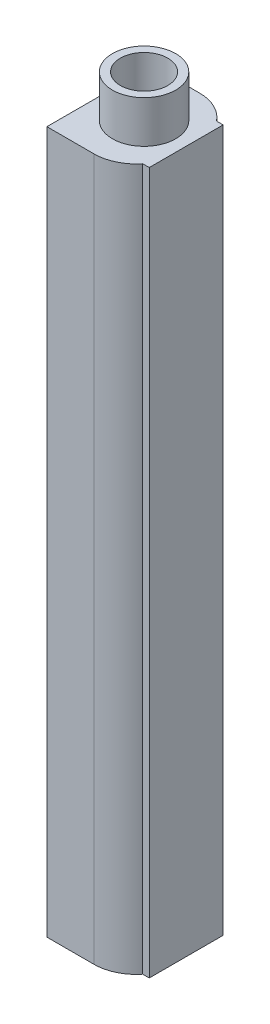
ISO-10303-21;
HEADER;
FILE_DESCRIPTION(('STEP AP214'),'2;1');
FILE_NAME('part.step','',(''),(''),'','','');
FILE_SCHEMA(('AUTOMOTIVE_DESIGN { 1 0 10303 214 1 1 1 1 }'));
ENDSEC;
DATA;
#1=APPLICATION_CONTEXT('core data for automotive mechanical design processes');
#2=APPLICATION_PROTOCOL_DEFINITION('international standard','automotive_design',2000,#1);
#3=PRODUCT_CONTEXT('',#1,'mechanical');
#4=PRODUCT('Part','Part','',(#3));
#5=PRODUCT_RELATED_PRODUCT_CATEGORY('part','',(#4));
#6=PRODUCT_DEFINITION_FORMATION('','',#4);
#7=PRODUCT_DEFINITION_CONTEXT('part definition',#1,'design');
#8=PRODUCT_DEFINITION('design','',#6,#7);
#9=PRODUCT_DEFINITION_SHAPE('','',#8);
#10=(LENGTH_UNIT() NAMED_UNIT(*) SI_UNIT(.MILLI.,.METRE.));
#11=(NAMED_UNIT(*) PLANE_ANGLE_UNIT() SI_UNIT($,.RADIAN.));
#12=(NAMED_UNIT(*) SI_UNIT($,.STERADIAN.) SOLID_ANGLE_UNIT());
#13=UNCERTAINTY_MEASURE_WITH_UNIT(LENGTH_MEASURE(1.E-05),#10,'distance_accuracy_value','');
#14=(GEOMETRIC_REPRESENTATION_CONTEXT(3) GLOBAL_UNCERTAINTY_ASSIGNED_CONTEXT((#13)) GLOBAL_UNIT_ASSIGNED_CONTEXT((#10,
#11,#12)) REPRESENTATION_CONTEXT('',''));
#15=CARTESIAN_POINT('',(0.,0.,0.));
#16=DIRECTION('',(0.,0.,1.));
#17=DIRECTION('',(1.,0.,0.));
#18=AXIS2_PLACEMENT_3D('',#15,#16,#17);
#19=CARTESIAN_POINT('',(-7.4849979983984,0.,5.));
#20=DIRECTION('',(0.,1.,0.));
#21=DIRECTION('',(0.,0.,1.));
#22=AXIS2_PLACEMENT_3D('',#19,#20,#21);
#23=PLANE('',#22);
#24=CARTESIAN_POINT('',(-7.4849979983984,0.,5.));
#25=DIRECTION('',(0.,1.,0.));
#26=DIRECTION('',(0.,0.,1.));
#27=AXIS2_PLACEMENT_3D('',#24,#25,#26);
#28=CIRCLE('',#27,6.5);
#29=CARTESIAN_POINT('',(-2.00777242334674,0.,1.5));
#30=VERTEX_POINT('',#29);
#31=CARTESIAN_POINT('',(-7.48499799839839,0.,-1.5));
#32=VERTEX_POINT('',#31);
#33=EDGE_CURVE('E366',#30,#32,#28,.T.);
#34=ORIENTED_EDGE('',*,*,#33,.T.);
#35=DIRECTION('',(-1.,0.,0.));
#36=VECTOR('',#35,1.);
#37=CARTESIAN_POINT('',(-7.48499799839839,0.,-1.5));
#38=LINE('',#37,#36);
#39=CARTESIAN_POINT('',(-14.9149979983984,0.,-1.5));
#40=VERTEX_POINT('',#39);
#41=EDGE_CURVE('E368',#32,#40,#38,.T.);
#42=ORIENTED_EDGE('',*,*,#41,.T.);
#43=DIRECTION('',(0.,0.,1.));
#44=VECTOR('',#43,1.);
#45=CARTESIAN_POINT('',(-14.9149979983984,0.,-1.5));
#46=LINE('',#45,#44);
#47=CARTESIAN_POINT('',(-14.9149979983984,0.,15.5));
#48=VERTEX_POINT('',#47);
#49=EDGE_CURVE('E371',#40,#48,#46,.T.);
#50=ORIENTED_EDGE('',*,*,#49,.T.);
#51=DIRECTION('',(1.,0.,0.));
#52=VECTOR('',#51,1.);
#53=CARTESIAN_POINT('',(-14.9149979983984,0.,15.5));
#54=LINE('',#53,#52);
#55=CARTESIAN_POINT('',(-7.4849979983984,0.,15.5));
#56=VERTEX_POINT('',#55);
#57=EDGE_CURVE('E374',#48,#56,#54,.T.);
#58=ORIENTED_EDGE('',*,*,#57,.T.);
#59=CARTESIAN_POINT('',(-7.4849979983984,0.,9.));
#60=DIRECTION('',(0.,1.,0.));
#61=DIRECTION('',(0.,0.,1.));
#62=AXIS2_PLACEMENT_3D('',#59,#60,#61);
#63=CIRCLE('',#62,6.5);
#64=CARTESIAN_POINT('',(-2.00777242334674,0.,12.5));
#65=VERTEX_POINT('',#64);
#66=EDGE_CURVE('E377',#56,#65,#63,.T.);
#67=ORIENTED_EDGE('',*,*,#66,.T.);
#68=DIRECTION('',(1.,0.,0.));
#69=VECTOR('',#68,1.);
#70=CARTESIAN_POINT('',(-2.00777242334674,0.,12.5));
#71=LINE('',#70,#69);
#72=CARTESIAN_POINT('',(-1.5,0.,12.5));
#73=VERTEX_POINT('',#72);
#74=EDGE_CURVE('E380',#65,#73,#71,.T.);
#75=ORIENTED_EDGE('',*,*,#74,.T.);
#76=DIRECTION('',(0.,0.,-1.));
#77=VECTOR('',#76,1.);
#78=CARTESIAN_POINT('',(-1.5,0.,12.5));
#79=LINE('',#78,#77);
#80=CARTESIAN_POINT('',(-1.5,0.,1.5));
#81=VERTEX_POINT('',#80);
#82=EDGE_CURVE('E383',#73,#81,#79,.T.);
#83=ORIENTED_EDGE('',*,*,#82,.T.);
#84=DIRECTION('',(-1.,0.,0.));
#85=VECTOR('',#84,1.);
#86=CARTESIAN_POINT('',(-1.5,0.,1.5));
#87=LINE('',#86,#85);
#88=EDGE_CURVE('E167',#81,#30,#87,.T.);
#89=ORIENTED_EDGE('',*,*,#88,.T.);
#90=EDGE_LOOP('',(#34,#42,#50,#58,#67,#75,#83,#89));
#91=FACE_BOUND('',#90,.T.);
#92=ADVANCED_FACE('F33',(#91),#23,.T.);
#93=CARTESIAN_POINT('',(-1.5,131.6,1.5));
#94=DIRECTION('',(0.,0.,1.));
#95=DIRECTION('',(1.,0.,0.));
#96=AXIS2_PLACEMENT_3D('',#93,#94,#95);
#97=PLANE('',#96);
#98=DIRECTION('',(0.,-1.,0.));
#99=VECTOR('',#98,1.);
#100=CARTESIAN_POINT('',(-1.5,131.6,1.5));
#101=LINE('',#100,#99);
#102=CARTESIAN_POINT('',(-1.5,130.1,1.5));
#103=VERTEX_POINT('',#102);
#104=EDGE_CURVE('E158',#103,#81,#101,.T.);
#105=ORIENTED_EDGE('',*,*,#104,.F.);
#106=DIRECTION('',(-1.,0.,0.));
#107=VECTOR('',#106,1.);
#108=CARTESIAN_POINT('',(-1.5,130.1,1.5));
#109=LINE('',#108,#107);
#110=CARTESIAN_POINT('',(-2.00777242334674,130.1,1.5));
#111=VERTEX_POINT('',#110);
#112=EDGE_CURVE('E42',#103,#111,#109,.T.);
#113=ORIENTED_EDGE('',*,*,#112,.T.);
#114=DIRECTION('',(0.,-1.,0.));
#115=VECTOR('',#114,1.);
#116=CARTESIAN_POINT('',(-2.00777242334674,131.6,1.5));
#117=LINE('',#116,#115);
#118=EDGE_CURVE('E168',#111,#30,#117,.T.);
#119=ORIENTED_EDGE('',*,*,#118,.T.);
#120=ORIENTED_EDGE('',*,*,#88,.F.);
#121=EDGE_LOOP('',(#105,#113,#119,#120));
#122=FACE_BOUND('',#121,.T.);
#123=ADVANCED_FACE('F165',(#122),#97,.T.);
#124=CARTESIAN_POINT('',(-1.5,131.6,12.5));
#125=DIRECTION('',(-1.,0.,0.));
#126=DIRECTION('',(0.,0.,1.));
#127=AXIS2_PLACEMENT_3D('',#124,#125,#126);
#128=PLANE('',#127);
#129=DIRECTION('',(0.,-1.,0.));
#130=VECTOR('',#129,1.);
#131=CARTESIAN_POINT('',(-1.5,131.6,12.5));
#132=LINE('',#131,#130);
#133=CARTESIAN_POINT('',(-1.5,130.1,12.5));
#134=VERTEX_POINT('',#133);
#135=EDGE_CURVE('E160',#134,#73,#132,.T.);
#136=ORIENTED_EDGE('',*,*,#135,.F.);
#137=DIRECTION('',(0.,0.,-1.));
#138=VECTOR('',#137,1.);
#139=CARTESIAN_POINT('',(-1.5,130.1,12.5));
#140=LINE('',#139,#138);
#141=EDGE_CURVE('E148',#134,#103,#140,.T.);
#142=ORIENTED_EDGE('',*,*,#141,.T.);
#143=ORIENTED_EDGE('',*,*,#104,.T.);
#144=ORIENTED_EDGE('',*,*,#82,.F.);
#145=EDGE_LOOP('',(#136,#142,#143,#144));
#146=FACE_BOUND('',#145,.T.);
#147=ADVANCED_FACE('F156',(#146),#128,.T.);
#148=CARTESIAN_POINT('',(-2.00777242334674,131.6,12.5));
#149=DIRECTION('',(0.,0.,-1.));
#150=DIRECTION('',(-1.,0.,0.));
#151=AXIS2_PLACEMENT_3D('',#148,#149,#150);
#152=PLANE('',#151);
#153=DIRECTION('',(0.,-1.,0.));
#154=VECTOR('',#153,1.);
#155=CARTESIAN_POINT('',(-2.00777242334674,131.6,12.5));
#156=LINE('',#155,#154);
#157=CARTESIAN_POINT('',(-2.00777242334674,130.1,12.5));
#158=VERTEX_POINT('',#157);
#159=EDGE_CURVE('E170',#158,#65,#156,.T.);
#160=ORIENTED_EDGE('',*,*,#159,.F.);
#161=DIRECTION('',(1.,0.,0.));
#162=VECTOR('',#161,1.);
#163=CARTESIAN_POINT('',(-2.00777242334674,130.1,12.5));
#164=LINE('',#163,#162);
#165=EDGE_CURVE('E161',#158,#134,#164,.T.);
#166=ORIENTED_EDGE('',*,*,#165,.T.);
#167=ORIENTED_EDGE('',*,*,#135,.T.);
#168=ORIENTED_EDGE('',*,*,#74,.F.);
#169=EDGE_LOOP('',(#160,#166,#167,#168));
#170=FACE_BOUND('',#169,.T.);
#171=ADVANCED_FACE('F320',(#170),#152,.T.);
#172=CARTESIAN_POINT('',(-7.4849979983984,131.6,9.));
#173=DIRECTION('',(0.,-1.,0.));
#174=DIRECTION('',(0.,0.,-1.));
#175=AXIS2_PLACEMENT_3D('',#172,#173,#174);
#176=CYLINDRICAL_SURFACE('',#175,6.5);
#177=DIRECTION('',(0.,-1.,0.));
#178=VECTOR('',#177,1.);
#179=CARTESIAN_POINT('',(-7.48499799839839,131.6,15.5));
#180=LINE('',#179,#178);
#181=CARTESIAN_POINT('',(-7.4849979983984,130.1,15.5));
#182=VERTEX_POINT('',#181);
#183=EDGE_CURVE('E176',#182,#56,#180,.T.);
#184=ORIENTED_EDGE('',*,*,#183,.F.);
#185=CARTESIAN_POINT('',(-7.4849979983984,130.1,9.));
#186=DIRECTION('',(0.,1.,0.));
#187=DIRECTION('',(0.,0.,1.));
#188=AXIS2_PLACEMENT_3D('',#185,#186,#187);
#189=CIRCLE('',#188,6.5);
#190=EDGE_CURVE('E353',#182,#158,#189,.T.);
#191=ORIENTED_EDGE('',*,*,#190,.T.);
#192=ORIENTED_EDGE('',*,*,#159,.T.);
#193=ORIENTED_EDGE('',*,*,#66,.F.);
#194=EDGE_LOOP('',(#184,#191,#192,#193));
#195=FACE_BOUND('',#194,.T.);
#196=ADVANCED_FACE('F316',(#195),#176,.F.);
#197=CARTESIAN_POINT('',(-14.9149979983984,131.6,15.5));
#198=DIRECTION('',(0.,0.,-1.));
#199=DIRECTION('',(-1.,0.,0.));
#200=AXIS2_PLACEMENT_3D('',#197,#198,#199);
#201=PLANE('',#200);
#202=DIRECTION('',(0.,-1.,0.));
#203=VECTOR('',#202,1.);
#204=CARTESIAN_POINT('',(-14.9149979983984,131.6,15.5));
#205=LINE('',#204,#203);
#206=CARTESIAN_POINT('',(-14.9149979983984,130.1,15.5));
#207=VERTEX_POINT('',#206);
#208=EDGE_CURVE('E178',#207,#48,#205,.T.);
#209=ORIENTED_EDGE('',*,*,#208,.F.);
#210=DIRECTION('',(1.,0.,0.));
#211=VECTOR('',#210,1.);
#212=CARTESIAN_POINT('',(-14.9149979983984,130.1,15.5));
#213=LINE('',#212,#211);
#214=EDGE_CURVE('E356',#207,#182,#213,.T.);
#215=ORIENTED_EDGE('',*,*,#214,.T.);
#216=ORIENTED_EDGE('',*,*,#183,.T.);
#217=ORIENTED_EDGE('',*,*,#57,.F.);
#218=EDGE_LOOP('',(#209,#215,#216,#217));
#219=FACE_BOUND('',#218,.T.);
#220=ADVANCED_FACE('F312',(#219),#201,.T.);
#221=CARTESIAN_POINT('',(-14.9149979983984,131.6,-1.5));
#222=DIRECTION('',(1.,0.,0.));
#223=DIRECTION('',(0.,0.,-1.));
#224=AXIS2_PLACEMENT_3D('',#221,#222,#223);
#225=PLANE('',#224);
#226=DIRECTION('',(0.,-1.,0.));
#227=VECTOR('',#226,1.);
#228=CARTESIAN_POINT('',(-14.9149979983984,131.6,-1.5));
#229=LINE('',#228,#227);
#230=CARTESIAN_POINT('',(-14.9149979983984,130.1,-1.5));
#231=VERTEX_POINT('',#230);
#232=EDGE_CURVE('E180',#231,#40,#229,.T.);
#233=ORIENTED_EDGE('',*,*,#232,.F.);
#234=DIRECTION('',(0.,0.,1.));
#235=VECTOR('',#234,1.);
#236=CARTESIAN_POINT('',(-14.9149979983984,130.1,-1.5));
#237=LINE('',#236,#235);
#238=EDGE_CURVE('E359',#231,#207,#237,.T.);
#239=ORIENTED_EDGE('',*,*,#238,.T.);
#240=ORIENTED_EDGE('',*,*,#208,.T.);
#241=ORIENTED_EDGE('',*,*,#49,.F.);
#242=EDGE_LOOP('',(#233,#239,#240,#241));
#243=FACE_BOUND('',#242,.T.);
#244=ADVANCED_FACE('F308',(#243),#225,.T.);
#245=CARTESIAN_POINT('',(-7.48499799839839,131.6,-1.5));
#246=DIRECTION('',(0.,0.,1.));
#247=DIRECTION('',(1.,0.,0.));
#248=AXIS2_PLACEMENT_3D('',#245,#246,#247);
#249=PLANE('',#248);
#250=DIRECTION('',(0.,-1.,0.));
#251=VECTOR('',#250,1.);
#252=CARTESIAN_POINT('',(-7.48499799839839,131.6,-1.5));
#253=LINE('',#252,#251);
#254=CARTESIAN_POINT('',(-7.48499799839839,130.1,-1.5));
#255=VERTEX_POINT('',#254);
#256=EDGE_CURVE('E57',#255,#32,#253,.T.);
#257=ORIENTED_EDGE('',*,*,#256,.F.);
#258=DIRECTION('',(-1.,0.,0.));
#259=VECTOR('',#258,1.);
#260=CARTESIAN_POINT('',(-7.48499799839839,130.1,-1.5));
#261=LINE('',#260,#259);
#262=EDGE_CURVE('E362',#255,#231,#261,.T.);
#263=ORIENTED_EDGE('',*,*,#262,.T.);
#264=ORIENTED_EDGE('',*,*,#232,.T.);
#265=ORIENTED_EDGE('',*,*,#41,.F.);
#266=EDGE_LOOP('',(#257,#263,#264,#265));
#267=FACE_BOUND('',#266,.T.);
#268=ADVANCED_FACE('F305',(#267),#249,.T.);
#269=CARTESIAN_POINT('',(-7.4849979983984,131.6,5.));
#270=DIRECTION('',(0.,-1.,0.));
#271=DIRECTION('',(0.,0.,-1.));
#272=AXIS2_PLACEMENT_3D('',#269,#270,#271);
#273=CYLINDRICAL_SURFACE('',#272,6.5);
#274=ORIENTED_EDGE('',*,*,#118,.F.);
#275=CARTESIAN_POINT('',(-7.4849979983984,130.1,5.));
#276=DIRECTION('',(0.,1.,0.));
#277=DIRECTION('',(0.,0.,1.));
#278=AXIS2_PLACEMENT_3D('',#275,#276,#277);
#279=CIRCLE('',#278,6.5);
#280=EDGE_CURVE('E50',#111,#255,#279,.T.);
#281=ORIENTED_EDGE('',*,*,#280,.T.);
#282=ORIENTED_EDGE('',*,*,#256,.T.);
#283=ORIENTED_EDGE('',*,*,#33,.F.);
#284=EDGE_LOOP('',(#274,#281,#282,#283));
#285=FACE_BOUND('',#284,.T.);
#286=ADVANCED_FACE('F302',(#285),#273,.F.);
#287=CARTESIAN_POINT('',(-7.4849979983984,130.1,5.));
#288=DIRECTION('',(0.,1.,0.));
#289=DIRECTION('',(0.,0.,1.));
#290=AXIS2_PLACEMENT_3D('',#287,#288,#289);
#291=PLANE('',#290);
#292=CARTESIAN_POINT('',(-8.2074989991992,130.1,6.78038674362202));
#293=DIRECTION('',(0.,1.,0.));
#294=DIRECTION('',(0.,0.,1.));
#295=AXIS2_PLACEMENT_3D('',#292,#293,#294);
#296=CIRCLE('',#295,4.5);
#297=CARTESIAN_POINT('',(-8.2074989991992,130.1,11.280386743622));
#298=VERTEX_POINT('',#297);
#299=EDGE_CURVE('E37',#298,#298,#296,.T.);
#300=ORIENTED_EDGE('',*,*,#299,.T.);
#301=EDGE_LOOP('',(#300));
#302=FACE_BOUND('',#301,.T.);
#303=ORIENTED_EDGE('',*,*,#280,.F.);
#304=ORIENTED_EDGE('',*,*,#112,.F.);
#305=ORIENTED_EDGE('',*,*,#141,.F.);
#306=ORIENTED_EDGE('',*,*,#165,.F.);
#307=ORIENTED_EDGE('',*,*,#190,.F.);
#308=ORIENTED_EDGE('',*,*,#214,.F.);
#309=ORIENTED_EDGE('',*,*,#238,.F.);
#310=ORIENTED_EDGE('',*,*,#262,.F.);
#311=EDGE_LOOP('',(#303,#304,#305,#306,#307,#308,#309,#310));
#312=FACE_BOUND('',#311,.T.);
#313=ADVANCED_FACE('F147',(#302,#312),#291,.F.);
#314=CARTESIAN_POINT('',(-16.4149979983984,-1.5,-3.));
#315=DIRECTION('',(0.,0.,-1.));
#316=DIRECTION('',(-1.,0.,0.));
#317=AXIS2_PLACEMENT_3D('',#314,#315,#316);
#318=PLANE('',#317);
#319=DIRECTION('',(-1.,0.,0.));
#320=VECTOR('',#319,1.);
#321=CARTESIAN_POINT('',(-7.48499799839839,131.6,-3.));
#322=LINE('',#321,#320);
#323=CARTESIAN_POINT('',(-7.48499799839839,131.6,-3.));
#324=VERTEX_POINT('',#323);
#325=CARTESIAN_POINT('',(-16.4149979983984,131.6,-3.));
#326=VERTEX_POINT('',#325);
#327=EDGE_CURVE('E183',#324,#326,#322,.T.);
#328=ORIENTED_EDGE('',*,*,#327,.F.);
#329=DIRECTION('',(0.,1.,0.));
#330=VECTOR('',#329,1.);
#331=CARTESIAN_POINT('',(-7.48499799839839,-1.5,-3.));
#332=LINE('',#331,#330);
#333=CARTESIAN_POINT('',(-7.48499799839839,-1.5,-3.));
#334=VERTEX_POINT('',#333);
#335=EDGE_CURVE('E153',#334,#324,#332,.T.);
#336=ORIENTED_EDGE('',*,*,#335,.F.);
#337=DIRECTION('',(-1.,0.,0.));
#338=VECTOR('',#337,1.);
#339=CARTESIAN_POINT('',(-16.4149979983984,-1.5,-3.));
#340=LINE('',#339,#338);
#341=CARTESIAN_POINT('',(-16.4149979983984,-1.5,-3.));
#342=VERTEX_POINT('',#341);
#343=EDGE_CURVE('E207',#334,#342,#340,.T.);
#344=ORIENTED_EDGE('',*,*,#343,.T.);
#345=DIRECTION('',(0.,1.,0.));
#346=VECTOR('',#345,1.);
#347=CARTESIAN_POINT('',(-16.4149979983984,-1.5,-3.));
#348=LINE('',#347,#346);
#349=EDGE_CURVE('E231',#342,#326,#348,.T.);
#350=ORIENTED_EDGE('',*,*,#349,.T.);
#351=EDGE_LOOP('',(#328,#336,#344,#350));
#352=FACE_BOUND('',#351,.T.);
#353=ADVANCED_FACE('F35',(#352),#318,.T.);
#354=CARTESIAN_POINT('',(-7.4849979983984,-1.5,5.));
#355=DIRECTION('',(0.,1.,0.));
#356=DIRECTION('',(0.,0.,1.));
#357=AXIS2_PLACEMENT_3D('',#354,#355,#356);
#358=CYLINDRICAL_SURFACE('',#357,8.);
#359=CARTESIAN_POINT('',(-7.4849979983984,131.6,5.));
#360=DIRECTION('',(0.,1.,0.));
#361=DIRECTION('',(0.,0.,1.));
#362=AXIS2_PLACEMENT_3D('',#359,#360,#361);
#363=CIRCLE('',#362,8.);
#364=CARTESIAN_POINT('',(-1.24,131.6,0.));
#365=VERTEX_POINT('',#364);
#366=EDGE_CURVE('E204',#365,#324,#363,.T.);
#367=ORIENTED_EDGE('',*,*,#366,.F.);
#368=DIRECTION('',(0.,1.,0.));
#369=VECTOR('',#368,1.);
#370=CARTESIAN_POINT('',(-1.24,-1.5,0.));
#371=LINE('',#370,#369);
#372=CARTESIAN_POINT('',(-1.24,-1.5,0.));
#373=VERTEX_POINT('',#372);
#374=EDGE_CURVE('E233',#373,#365,#371,.T.);
#375=ORIENTED_EDGE('',*,*,#374,.F.);
#376=CARTESIAN_POINT('',(-7.4849979983984,-1.5,5.));
#377=DIRECTION('',(0.,1.,0.));
#378=DIRECTION('',(0.,0.,1.));
#379=AXIS2_PLACEMENT_3D('',#376,#377,#378);
#380=CIRCLE('',#379,8.);
#381=EDGE_CURVE('E228',#373,#334,#380,.T.);
#382=ORIENTED_EDGE('',*,*,#381,.T.);
#383=ORIENTED_EDGE('',*,*,#335,.T.);
#384=EDGE_LOOP('',(#367,#375,#382,#383));
#385=FACE_BOUND('',#384,.T.);
#386=ADVANCED_FACE('F258',(#385),#358,.T.);
#387=CARTESIAN_POINT('',(0.,-1.5,0.));
#388=DIRECTION('',(0.,0.,-1.));
#389=DIRECTION('',(-1.,0.,0.));
#390=AXIS2_PLACEMENT_3D('',#387,#388,#389);
#391=PLANE('',#390);
#392=DIRECTION('',(-1.,0.,0.));
#393=VECTOR('',#392,1.);
#394=CARTESIAN_POINT('',(0.,131.6,0.));
#395=LINE('',#394,#393);
#396=CARTESIAN_POINT('',(0.,131.6,0.));
#397=VERTEX_POINT('',#396);
#398=EDGE_CURVE('E201',#397,#365,#395,.T.);
#399=ORIENTED_EDGE('',*,*,#398,.F.);
#400=DIRECTION('',(0.,1.,0.));
#401=VECTOR('',#400,1.);
#402=CARTESIAN_POINT('',(0.,-1.5,0.));
#403=LINE('',#402,#401);
#404=CARTESIAN_POINT('',(0.,-1.5,0.));
#405=VERTEX_POINT('',#404);
#406=EDGE_CURVE('E235',#405,#397,#403,.T.);
#407=ORIENTED_EDGE('',*,*,#406,.F.);
#408=DIRECTION('',(-1.,0.,0.));
#409=VECTOR('',#408,1.);
#410=CARTESIAN_POINT('',(0.,-1.5,0.));
#411=LINE('',#410,#409);
#412=EDGE_CURVE('E225',#405,#373,#411,.T.);
#413=ORIENTED_EDGE('',*,*,#412,.T.);
#414=ORIENTED_EDGE('',*,*,#374,.T.);
#415=EDGE_LOOP('',(#399,#407,#413,#414));
#416=FACE_BOUND('',#415,.T.);
#417=ADVANCED_FACE('F279',(#416),#391,.T.);
#418=CARTESIAN_POINT('',(0.,-1.5,14.));
#419=DIRECTION('',(1.,0.,0.));
#420=DIRECTION('',(0.,0.,-1.));
#421=AXIS2_PLACEMENT_3D('',#418,#419,#420);
#422=PLANE('',#421);
#423=DIRECTION('',(0.,0.,-1.));
#424=VECTOR('',#423,1.);
#425=CARTESIAN_POINT('',(0.,131.6,14.));
#426=LINE('',#425,#424);
#427=CARTESIAN_POINT('',(0.,131.6,14.));
#428=VERTEX_POINT('',#427);
#429=EDGE_CURVE('E198',#428,#397,#426,.T.);
#430=ORIENTED_EDGE('',*,*,#429,.F.);
#431=DIRECTION('',(0.,1.,0.));
#432=VECTOR('',#431,1.);
#433=CARTESIAN_POINT('',(0.,-1.5,14.));
#434=LINE('',#433,#432);
#435=CARTESIAN_POINT('',(0.,-1.5,14.));
#436=VERTEX_POINT('',#435);
#437=EDGE_CURVE('E237',#436,#428,#434,.T.);
#438=ORIENTED_EDGE('',*,*,#437,.F.);
#439=DIRECTION('',(0.,0.,-1.));
#440=VECTOR('',#439,1.);
#441=CARTESIAN_POINT('',(0.,-1.5,14.));
#442=LINE('',#441,#440);
#443=EDGE_CURVE('E222',#436,#405,#442,.T.);
#444=ORIENTED_EDGE('',*,*,#443,.T.);
#445=ORIENTED_EDGE('',*,*,#406,.T.);
#446=EDGE_LOOP('',(#430,#438,#444,#445));
#447=FACE_BOUND('',#446,.T.);
#448=ADVANCED_FACE('F277',(#447),#422,.T.);
#449=CARTESIAN_POINT('',(-1.24,-1.5,14.));
#450=DIRECTION('',(0.,0.,1.));
#451=DIRECTION('',(1.,0.,0.));
#452=AXIS2_PLACEMENT_3D('',#449,#450,#451);
#453=PLANE('',#452);
#454=DIRECTION('',(1.,0.,0.));
#455=VECTOR('',#454,1.);
#456=CARTESIAN_POINT('',(-1.24,131.6,14.));
#457=LINE('',#456,#455);
#458=CARTESIAN_POINT('',(-1.24,131.6,14.));
#459=VERTEX_POINT('',#458);
#460=EDGE_CURVE('E195',#459,#428,#457,.T.);
#461=ORIENTED_EDGE('',*,*,#460,.F.);
#462=DIRECTION('',(0.,1.,0.));
#463=VECTOR('',#462,1.);
#464=CARTESIAN_POINT('',(-1.24,-1.5,14.));
#465=LINE('',#464,#463);
#466=CARTESIAN_POINT('',(-1.24,-1.5,14.));
#467=VERTEX_POINT('',#466);
#468=EDGE_CURVE('E239',#467,#459,#465,.T.);
#469=ORIENTED_EDGE('',*,*,#468,.F.);
#470=DIRECTION('',(1.,0.,0.));
#471=VECTOR('',#470,1.);
#472=CARTESIAN_POINT('',(-1.24,-1.5,14.));
#473=LINE('',#472,#471);
#474=EDGE_CURVE('E219',#467,#436,#473,.T.);
#475=ORIENTED_EDGE('',*,*,#474,.T.);
#476=ORIENTED_EDGE('',*,*,#437,.T.);
#477=EDGE_LOOP('',(#461,#469,#475,#476));
#478=FACE_BOUND('',#477,.T.);
#479=ADVANCED_FACE('F273',(#478),#453,.T.);
#480=CARTESIAN_POINT('',(-7.4849979983984,-1.5,9.));
#481=DIRECTION('',(0.,1.,0.));
#482=DIRECTION('',(0.,0.,1.));
#483=AXIS2_PLACEMENT_3D('',#480,#481,#482);
#484=CYLINDRICAL_SURFACE('',#483,8.);
#485=CARTESIAN_POINT('',(-7.4849979983984,131.6,9.));
#486=DIRECTION('',(0.,1.,0.));
#487=DIRECTION('',(0.,0.,1.));
#488=AXIS2_PLACEMENT_3D('',#485,#486,#487);
#489=CIRCLE('',#488,8.);
#490=CARTESIAN_POINT('',(-7.48499799839839,131.6,17.));
#491=VERTEX_POINT('',#490);
#492=EDGE_CURVE('E192',#491,#459,#489,.T.);
#493=ORIENTED_EDGE('',*,*,#492,.F.);
#494=DIRECTION('',(0.,1.,0.));
#495=VECTOR('',#494,1.);
#496=CARTESIAN_POINT('',(-7.4849979983984,-1.5,17.));
#497=LINE('',#496,#495);
#498=CARTESIAN_POINT('',(-7.4849979983984,-1.5,17.));
#499=VERTEX_POINT('',#498);
#500=EDGE_CURVE('E241',#499,#491,#497,.T.);
#501=ORIENTED_EDGE('',*,*,#500,.F.);
#502=CARTESIAN_POINT('',(-7.4849979983984,-1.5,9.));
#503=DIRECTION('',(0.,1.,0.));
#504=DIRECTION('',(0.,0.,-1.));
#505=AXIS2_PLACEMENT_3D('',#502,#503,#504);
#506=CIRCLE('',#505,8.);
#507=EDGE_CURVE('E216',#499,#467,#506,.T.);
#508=ORIENTED_EDGE('',*,*,#507,.T.);
#509=ORIENTED_EDGE('',*,*,#468,.T.);
#510=EDGE_LOOP('',(#493,#501,#508,#509));
#511=FACE_BOUND('',#510,.T.);
#512=ADVANCED_FACE('F271',(#511),#484,.T.);
#513=CARTESIAN_POINT('',(-16.4149979983984,-1.5,17.));
#514=DIRECTION('',(0.,0.,1.));
#515=DIRECTION('',(1.,0.,0.));
#516=AXIS2_PLACEMENT_3D('',#513,#514,#515);
#517=PLANE('',#516);
#518=DIRECTION('',(1.,0.,0.));
#519=VECTOR('',#518,1.);
#520=CARTESIAN_POINT('',(-16.4149979983984,131.6,17.));
#521=LINE('',#520,#519);
#522=CARTESIAN_POINT('',(-16.4149979983984,131.6,17.));
#523=VERTEX_POINT('',#522);
#524=EDGE_CURVE('E189',#523,#491,#521,.T.);
#525=ORIENTED_EDGE('',*,*,#524,.F.);
#526=DIRECTION('',(0.,1.,0.));
#527=VECTOR('',#526,1.);
#528=CARTESIAN_POINT('',(-16.4149979983984,-1.5,17.));
#529=LINE('',#528,#527);
#530=CARTESIAN_POINT('',(-16.4149979983984,-1.5,17.));
#531=VERTEX_POINT('',#530);
#532=EDGE_CURVE('E243',#531,#523,#529,.T.);
#533=ORIENTED_EDGE('',*,*,#532,.F.);
#534=DIRECTION('',(1.,0.,0.));
#535=VECTOR('',#534,1.);
#536=CARTESIAN_POINT('',(-16.4149979983984,-1.5,17.));
#537=LINE('',#536,#535);
#538=EDGE_CURVE('E213',#531,#499,#537,.T.);
#539=ORIENTED_EDGE('',*,*,#538,.T.);
#540=ORIENTED_EDGE('',*,*,#500,.T.);
#541=EDGE_LOOP('',(#525,#533,#539,#540));
#542=FACE_BOUND('',#541,.T.);
#543=ADVANCED_FACE('F267',(#542),#517,.T.);
#544=CARTESIAN_POINT('',(-16.4149979983984,-1.5,-3.));
#545=DIRECTION('',(-1.,0.,0.));
#546=DIRECTION('',(0.,0.,1.));
#547=AXIS2_PLACEMENT_3D('',#544,#545,#546);
#548=PLANE('',#547);
#549=DIRECTION('',(0.,0.,1.));
#550=VECTOR('',#549,1.);
#551=CARTESIAN_POINT('',(-16.4149979983984,131.6,-3.));
#552=LINE('',#551,#550);
#553=EDGE_CURVE('E186',#326,#523,#552,.T.);
#554=ORIENTED_EDGE('',*,*,#553,.F.);
#555=ORIENTED_EDGE('',*,*,#349,.F.);
#556=DIRECTION('',(0.,0.,1.));
#557=VECTOR('',#556,1.);
#558=CARTESIAN_POINT('',(-16.4149979983984,-1.5,-3.));
#559=LINE('',#558,#557);
#560=EDGE_CURVE('E210',#342,#531,#559,.T.);
#561=ORIENTED_EDGE('',*,*,#560,.T.);
#562=ORIENTED_EDGE('',*,*,#532,.T.);
#563=EDGE_LOOP('',(#554,#555,#561,#562));
#564=FACE_BOUND('',#563,.T.);
#565=ADVANCED_FACE('F251',(#564),#548,.T.);
#566=CARTESIAN_POINT('',(-7.4849979983984,-1.5,5.));
#567=DIRECTION('',(0.,1.,0.));
#568=DIRECTION('',(0.,0.,1.));
#569=AXIS2_PLACEMENT_3D('',#566,#567,#568);
#570=PLANE('',#569);
#571=ORIENTED_EDGE('',*,*,#343,.F.);
#572=ORIENTED_EDGE('',*,*,#381,.F.);
#573=ORIENTED_EDGE('',*,*,#412,.F.);
#574=ORIENTED_EDGE('',*,*,#443,.F.);
#575=ORIENTED_EDGE('',*,*,#474,.F.);
#576=ORIENTED_EDGE('',*,*,#507,.F.);
#577=ORIENTED_EDGE('',*,*,#538,.F.);
#578=ORIENTED_EDGE('',*,*,#560,.F.);
#579=EDGE_LOOP('',(#571,#572,#573,#574,#575,#576,#577,#578));
#580=FACE_BOUND('',#579,.T.);
#581=ADVANCED_FACE('F261',(#580),#570,.F.);
#582=CARTESIAN_POINT('',(-7.4849979983984,131.6,9.));
#583=DIRECTION('',(0.,1.,0.));
#584=DIRECTION('',(0.,0.,1.));
#585=AXIS2_PLACEMENT_3D('',#582,#583,#584);
#586=PLANE('',#585);
#587=CARTESIAN_POINT('',(-8.2074989991992,131.6,6.78038674362202));
#588=DIRECTION('',(0.,1.,0.));
#589=DIRECTION('',(0.,0.,1.));
#590=AXIS2_PLACEMENT_3D('',#587,#588,#589);
#591=CIRCLE('',#590,6.);
#592=CARTESIAN_POINT('',(-8.2074989991992,131.6,12.780386743622));
#593=VERTEX_POINT('',#592);
#594=EDGE_CURVE('E11',#593,#593,#591,.T.);
#595=ORIENTED_EDGE('',*,*,#594,.F.);
#596=EDGE_LOOP('',(#595));
#597=FACE_BOUND('',#596,.T.);
#598=ORIENTED_EDGE('',*,*,#327,.T.);
#599=ORIENTED_EDGE('',*,*,#553,.T.);
#600=ORIENTED_EDGE('',*,*,#524,.T.);
#601=ORIENTED_EDGE('',*,*,#492,.T.);
#602=ORIENTED_EDGE('',*,*,#460,.T.);
#603=ORIENTED_EDGE('',*,*,#429,.T.);
#604=ORIENTED_EDGE('',*,*,#398,.T.);
#605=ORIENTED_EDGE('',*,*,#366,.T.);
#606=EDGE_LOOP('',(#598,#599,#600,#601,#602,#603,#604,#605));
#607=FACE_BOUND('',#606,.T.);
#608=ADVANCED_FACE('F254',(#597,#607),#586,.T.);
#609=CARTESIAN_POINT('',(-8.2074989991992,139.6,6.78038674362202));
#610=DIRECTION('',(0.,1.,0.));
#611=DIRECTION('',(0.,0.,1.));
#612=AXIS2_PLACEMENT_3D('',#609,#610,#611);
#613=PLANE('',#612);
#614=CARTESIAN_POINT('',(-8.2074989991992,139.6,6.78038674362202));
#615=DIRECTION('',(0.,1.,0.));
#616=DIRECTION('',(0.,0.,1.));
#617=AXIS2_PLACEMENT_3D('',#614,#615,#616);
#618=CIRCLE('',#617,6.);
#619=CARTESIAN_POINT('',(-8.2074989991992,139.6,12.780386743622));
#620=VERTEX_POINT('',#619);
#621=EDGE_CURVE('E162',#620,#620,#618,.T.);
#622=ORIENTED_EDGE('',*,*,#621,.T.);
#623=EDGE_LOOP('',(#622));
#624=FACE_BOUND('',#623,.T.);
#625=CARTESIAN_POINT('',(-8.2074989991992,139.6,6.78038674362202));
#626=DIRECTION('',(0.,1.,0.));
#627=DIRECTION('',(0.,0.,1.));
#628=AXIS2_PLACEMENT_3D('',#625,#626,#627);
#629=CIRCLE('',#628,4.5);
#630=CARTESIAN_POINT('',(-8.2074989991992,139.6,11.280386743622));
#631=VERTEX_POINT('',#630);
#632=EDGE_CURVE('E345',#631,#631,#629,.T.);
#633=ORIENTED_EDGE('',*,*,#632,.F.);
#634=EDGE_LOOP('',(#633));
#635=FACE_BOUND('',#634,.T.);
#636=ADVANCED_FACE('F300',(#624,#635),#613,.T.);
#637=CARTESIAN_POINT('',(-8.2074989991992,139.6,6.78038674362202));
#638=DIRECTION('',(0.,-1.,0.));
#639=DIRECTION('',(0.,0.,-1.));
#640=AXIS2_PLACEMENT_3D('',#637,#638,#639);
#641=CYLINDRICAL_SURFACE('',#640,6.);
#642=ORIENTED_EDGE('',*,*,#621,.F.);
#643=EDGE_LOOP('',(#642));
#644=FACE_BOUND('',#643,.T.);
#645=ORIENTED_EDGE('',*,*,#594,.T.);
#646=EDGE_LOOP('',(#645));
#647=FACE_BOUND('',#646,.T.);
#648=ADVANCED_FACE('F330',(#644,#647),#641,.T.);
#649=CARTESIAN_POINT('',(-8.2074989991992,139.6,6.78038674362202));
#650=DIRECTION('',(0.,-1.,0.));
#651=DIRECTION('',(0.,0.,-1.));
#652=AXIS2_PLACEMENT_3D('',#649,#650,#651);
#653=CYLINDRICAL_SURFACE('',#652,4.5);
#654=ORIENTED_EDGE('',*,*,#632,.T.);
#655=EDGE_LOOP('',(#654));
#656=FACE_BOUND('',#655,.T.);
#657=ORIENTED_EDGE('',*,*,#299,.F.);
#658=EDGE_LOOP('',(#657));
#659=FACE_BOUND('',#658,.T.);
#660=ADVANCED_FACE('F333',(#656,#659),#653,.F.);
#661=CLOSED_SHELL('',(#92,#123,#147,#171,#196,#220,#244,#268,#286,#313,#353,#386,#417,#448,#479,
#512,#543,#565,#581,#608,#636,#648,#660));
#662=MANIFOLD_SOLID_BREP('B2',#661);
#663=ADVANCED_BREP_SHAPE_REPRESENTATION('',(#18,#662),#14);
#664=SHAPE_DEFINITION_REPRESENTATION(#9,#663);
ENDSEC;
END-ISO-10303-21;
